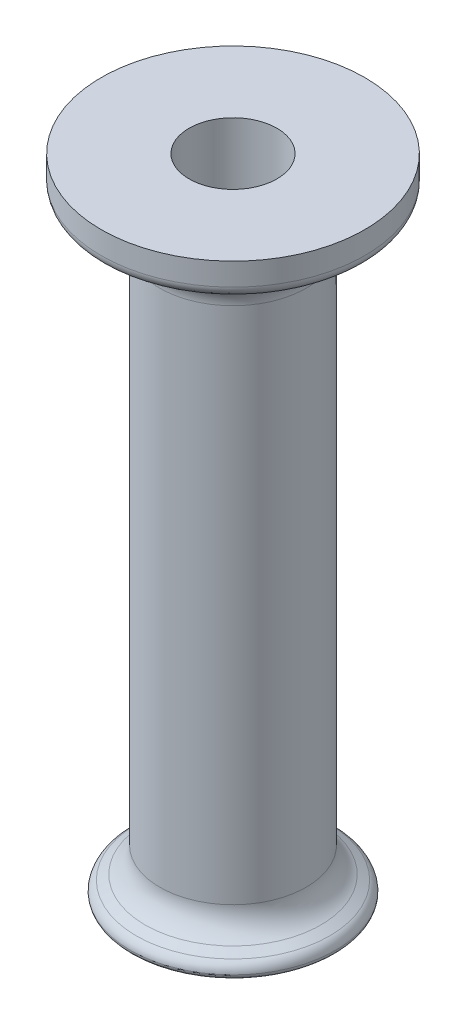
ISO-10303-21;
HEADER;
FILE_DESCRIPTION(('STEP AP214'),'2;1');
FILE_NAME('part.step','',(''),(''),'','','');
FILE_SCHEMA(('AUTOMOTIVE_DESIGN { 1 0 10303 214 1 1 1 1 }'));
ENDSEC;
DATA;
#1=APPLICATION_CONTEXT('core data for automotive mechanical design processes');
#2=APPLICATION_PROTOCOL_DEFINITION('international standard','automotive_design',2000,#1);
#3=PRODUCT_CONTEXT('',#1,'mechanical');
#4=PRODUCT('Part','Part','',(#3));
#5=PRODUCT_RELATED_PRODUCT_CATEGORY('part','',(#4));
#6=PRODUCT_DEFINITION_FORMATION('','',#4);
#7=PRODUCT_DEFINITION_CONTEXT('part definition',#1,'design');
#8=PRODUCT_DEFINITION('design','',#6,#7);
#9=PRODUCT_DEFINITION_SHAPE('','',#8);
#10=(LENGTH_UNIT() NAMED_UNIT(*) SI_UNIT(.MILLI.,.METRE.));
#11=(NAMED_UNIT(*) PLANE_ANGLE_UNIT() SI_UNIT($,.RADIAN.));
#12=(NAMED_UNIT(*) SI_UNIT($,.STERADIAN.) SOLID_ANGLE_UNIT());
#13=UNCERTAINTY_MEASURE_WITH_UNIT(LENGTH_MEASURE(1.E-05),#10,'distance_accuracy_value','');
#14=(GEOMETRIC_REPRESENTATION_CONTEXT(3) GLOBAL_UNCERTAINTY_ASSIGNED_CONTEXT((#13)) GLOBAL_UNIT_ASSIGNED_CONTEXT((#10,
#11,#12)) REPRESENTATION_CONTEXT('',''));
#15=CARTESIAN_POINT('',(0.,0.,0.));
#16=DIRECTION('',(0.,0.,1.));
#17=DIRECTION('',(1.,0.,0.));
#18=AXIS2_PLACEMENT_3D('',#15,#16,#17);
#19=CARTESIAN_POINT('',(0.,-51.5566243270259,0.));
#20=DIRECTION('',(0.,-1.,0.));
#21=DIRECTION('',(0.,0.,-1.));
#22=AXIS2_PLACEMENT_3D('',#19,#20,#21);
#23=CONICAL_SURFACE('',#22,15.,1.04719755119659);
#24=CARTESIAN_POINT('',(0.,-52.4226497308104,0.));
#25=DIRECTION('',(0.,-1.,0.));
#26=DIRECTION('',(0.,0.,-1.));
#27=AXIS2_PLACEMENT_3D('',#24,#25,#26);
#28=CIRCLE('',#27,16.5);
#29=CARTESIAN_POINT('',(0.,-52.4226497308104,-16.5));
#30=VERTEX_POINT('',#29);
#31=EDGE_CURVE('E55',#30,#30,#28,.T.);
#32=ORIENTED_EDGE('',*,*,#31,.F.);
#33=EDGE_LOOP('',(#32));
#34=FACE_BOUND('',#33,.T.);
#35=CARTESIAN_POINT('',(0.,-51.5566243270259,0.));
#36=DIRECTION('',(0.,-1.,0.));
#37=DIRECTION('',(0.,0.,-1.));
#38=AXIS2_PLACEMENT_3D('',#35,#36,#37);
#39=CIRCLE('',#38,15.);
#40=CARTESIAN_POINT('',(0.,-51.5566243270259,-15.));
#41=VERTEX_POINT('',#40);
#42=EDGE_CURVE('E85',#41,#41,#39,.T.);
#43=ORIENTED_EDGE('',*,*,#42,.T.);
#44=EDGE_LOOP('',(#43));
#45=FACE_BOUND('',#44,.T.);
#46=ADVANCED_FACE('F41',(#34,#45),#23,.T.);
#47=CARTESIAN_POINT('',(0.,-54.1547005383792,0.));
#48=DIRECTION('',(0.,-1.,0.));
#49=DIRECTION('',(0.,0.,-1.));
#50=AXIS2_PLACEMENT_3D('',#47,#48,#49);
#51=TOROIDAL_SURFACE('',#50,15.5,2.);
#52=CARTESIAN_POINT('',(0.,-54.0640694137426,0.));
#53=DIRECTION('',(0.,-1.,0.));
#54=DIRECTION('',(0.,0.,-1.));
#55=AXIS2_PLACEMENT_3D('',#52,#53,#54);
#56=CIRCLE('',#55,17.4979454445122);
#57=CARTESIAN_POINT('',(0.,-54.0640694137426,-17.4979454445122));
#58=VERTEX_POINT('',#57);
#59=EDGE_CURVE('E57',#58,#58,#56,.T.);
#60=ORIENTED_EDGE('',*,*,#59,.F.);
#61=EDGE_LOOP('',(#60));
#62=FACE_BOUND('',#61,.T.);
#63=ORIENTED_EDGE('',*,*,#31,.T.);
#64=EDGE_LOOP('',(#63));
#65=FACE_BOUND('',#64,.T.);
#66=ADVANCED_FACE('F104',(#62,#65),#51,.T.);
#67=CARTESIAN_POINT('',(0.,-54.,0.));
#68=DIRECTION('',(0.,-1.,0.));
#69=DIRECTION('',(0.,0.,-1.));
#70=AXIS2_PLACEMENT_3D('',#67,#68,#69);
#71=TOROIDAL_SURFACE('',#70,16.5,1.);
#72=CARTESIAN_POINT('',(0.,-55.,0.));
#73=DIRECTION('',(0.,-1.,0.));
#74=DIRECTION('',(0.,0.,-1.));
#75=AXIS2_PLACEMENT_3D('',#72,#73,#74);
#76=CIRCLE('',#75,16.5);
#77=CARTESIAN_POINT('',(0.,-55.,-16.5));
#78=VERTEX_POINT('',#77);
#79=EDGE_CURVE('E61',#78,#78,#76,.T.);
#80=ORIENTED_EDGE('',*,*,#79,.F.);
#81=EDGE_LOOP('',(#80));
#82=FACE_BOUND('',#81,.T.);
#83=ORIENTED_EDGE('',*,*,#59,.T.);
#84=EDGE_LOOP('',(#83));
#85=FACE_BOUND('',#84,.T.);
#86=ADVANCED_FACE('F109',(#82,#85),#71,.T.);
#87=CARTESIAN_POINT('',(0.,-55.,0.));
#88=DIRECTION('',(0.,-1.,0.));
#89=DIRECTION('',(0.,0.,-1.));
#90=AXIS2_PLACEMENT_3D('',#87,#88,#89);
#91=PLANE('',#90);
#92=ORIENTED_EDGE('',*,*,#79,.T.);
#93=EDGE_LOOP('',(#92));
#94=FACE_BOUND('',#93,.T.);
#95=CARTESIAN_POINT('',(0.,-55.,0.));
#96=DIRECTION('',(0.,-1.,0.));
#97=DIRECTION('',(0.,0.,-1.));
#98=AXIS2_PLACEMENT_3D('',#95,#96,#97);
#99=CIRCLE('',#98,7.5);
#100=CARTESIAN_POINT('',(0.,-55.,-7.5));
#101=VERTEX_POINT('',#100);
#102=EDGE_CURVE('E63',#101,#101,#99,.T.);
#103=ORIENTED_EDGE('',*,*,#102,.F.);
#104=EDGE_LOOP('',(#103));
#105=FACE_BOUND('',#104,.T.);
#106=ADVANCED_FACE('F117',(#94,#105),#91,.T.);
#107=CARTESIAN_POINT('',(0.,-16.1050714726648,0.));
#108=DIRECTION('',(0.,-1.,0.));
#109=DIRECTION('',(0.,0.,-1.));
#110=AXIS2_PLACEMENT_3D('',#107,#108,#109);
#111=CYLINDRICAL_SURFACE('',#110,7.5);
#112=CARTESIAN_POINT('',(0.,55.,0.));
#113=DIRECTION('',(0.,-1.,0.));
#114=DIRECTION('',(0.,0.,-1.));
#115=AXIS2_PLACEMENT_3D('',#112,#113,#114);
#116=CIRCLE('',#115,7.5);
#117=CARTESIAN_POINT('',(0.,55.,-7.5));
#118=VERTEX_POINT('',#117);
#119=EDGE_CURVE('E70',#118,#118,#116,.T.);
#120=ORIENTED_EDGE('',*,*,#119,.F.);
#121=EDGE_LOOP('',(#120));
#122=FACE_BOUND('',#121,.T.);
#123=ORIENTED_EDGE('',*,*,#102,.T.);
#124=EDGE_LOOP('',(#123));
#125=FACE_BOUND('',#124,.T.);
#126=ADVANCED_FACE('F122',(#122,#125),#111,.F.);
#127=CARTESIAN_POINT('',(0.,55.,0.));
#128=DIRECTION('',(0.,1.,0.));
#129=DIRECTION('',(0.,0.,1.));
#130=AXIS2_PLACEMENT_3D('',#127,#128,#129);
#131=PLANE('',#130);
#132=ORIENTED_EDGE('',*,*,#119,.T.);
#133=EDGE_LOOP('',(#132));
#134=FACE_BOUND('',#133,.T.);
#135=CARTESIAN_POINT('',(0.,55.,0.));
#136=DIRECTION('',(0.,-1.,0.));
#137=DIRECTION('',(0.,0.,-1.));
#138=AXIS2_PLACEMENT_3D('',#135,#136,#137);
#139=CIRCLE('',#138,22.5);
#140=CARTESIAN_POINT('',(0.,55.,-22.5));
#141=VERTEX_POINT('',#140);
#142=EDGE_CURVE('E66',#141,#141,#139,.T.);
#143=ORIENTED_EDGE('',*,*,#142,.F.);
#144=EDGE_LOOP('',(#143));
#145=FACE_BOUND('',#144,.T.);
#146=ADVANCED_FACE('F121',(#134,#145),#131,.T.);
#147=CARTESIAN_POINT('',(0.,-16.1050714726648,0.));
#148=DIRECTION('',(0.,-1.,0.));
#149=DIRECTION('',(0.,0.,-1.));
#150=AXIS2_PLACEMENT_3D('',#147,#148,#149);
#151=CYLINDRICAL_SURFACE('',#150,22.5);
#152=CARTESIAN_POINT('',(0.,51.1547005383793,0.));
#153=DIRECTION('',(0.,1.,0.));
#154=DIRECTION('',(0.,0.,1.));
#155=AXIS2_PLACEMENT_3D('',#152,#153,#154);
#156=CIRCLE('',#155,22.5);
#157=CARTESIAN_POINT('',(0.,51.1547005383793,22.5));
#158=VERTEX_POINT('',#157);
#159=EDGE_CURVE('E10',#158,#158,#156,.T.);
#160=ORIENTED_EDGE('',*,*,#159,.T.);
#161=EDGE_LOOP('',(#160));
#162=FACE_BOUND('',#161,.T.);
#163=ORIENTED_EDGE('',*,*,#142,.T.);
#164=EDGE_LOOP('',(#163));
#165=FACE_BOUND('',#164,.T.);
#166=ADVANCED_FACE('F129',(#162,#165),#151,.T.);
#167=CARTESIAN_POINT('',(0.,45.6698729810779,0.));
#168=DIRECTION('',(0.,1.,0.));
#169=DIRECTION('',(0.,0.,1.));
#170=AXIS2_PLACEMENT_3D('',#167,#168,#169);
#171=CONICAL_SURFACE('',#170,15.,1.0471975511966);
#172=CARTESIAN_POINT('',(0.,49.4226497308104,0.));
#173=DIRECTION('',(0.,-1.,0.));
#174=DIRECTION('',(0.,0.,-1.));
#175=AXIS2_PLACEMENT_3D('',#172,#173,#174);
#176=CIRCLE('',#175,21.5);
#177=CARTESIAN_POINT('',(0.,49.4226497308104,-21.5));
#178=VERTEX_POINT('',#177);
#179=EDGE_CURVE('E48',#178,#178,#176,.T.);
#180=ORIENTED_EDGE('',*,*,#179,.T.);
#181=EDGE_LOOP('',(#180));
#182=FACE_BOUND('',#181,.T.);
#183=CARTESIAN_POINT('',(0.,45.6698729810779,0.));
#184=DIRECTION('',(0.,-1.,0.));
#185=DIRECTION('',(0.,0.,-1.));
#186=AXIS2_PLACEMENT_3D('',#183,#184,#185);
#187=CIRCLE('',#186,15.);
#188=CARTESIAN_POINT('',(0.,45.6698729810779,-15.));
#189=VERTEX_POINT('',#188);
#190=EDGE_CURVE('E71',#189,#189,#187,.T.);
#191=ORIENTED_EDGE('',*,*,#190,.F.);
#192=EDGE_LOOP('',(#191));
#193=FACE_BOUND('',#192,.T.);
#194=ADVANCED_FACE('F101',(#182,#193),#171,.T.);
#195=CARTESIAN_POINT('',(0.,41.3397459621556,0.));
#196=DIRECTION('',(0.,-1.,0.));
#197=DIRECTION('',(0.,0.,-1.));
#198=AXIS2_PLACEMENT_3D('',#195,#196,#197);
#199=TOROIDAL_SURFACE('',#198,17.5,5.00000000000002);
#200=ORIENTED_EDGE('',*,*,#190,.T.);
#201=EDGE_LOOP('',(#200));
#202=FACE_BOUND('',#201,.T.);
#203=CARTESIAN_POINT('',(0.,41.3397459621557,0.));
#204=DIRECTION('',(0.,-1.,0.));
#205=DIRECTION('',(0.,0.,-1.));
#206=AXIS2_PLACEMENT_3D('',#203,#204,#205);
#207=CIRCLE('',#206,12.5);
#208=CARTESIAN_POINT('',(0.,41.3397459621557,-12.5));
#209=VERTEX_POINT('',#208);
#210=EDGE_CURVE('E76',#209,#209,#207,.T.);
#211=ORIENTED_EDGE('',*,*,#210,.F.);
#212=EDGE_LOOP('',(#211));
#213=FACE_BOUND('',#212,.T.);
#214=ADVANCED_FACE('F92',(#202,#213),#199,.F.);
#215=CARTESIAN_POINT('',(0.,-16.1050714726648,0.));
#216=DIRECTION('',(0.,-1.,0.));
#217=DIRECTION('',(0.,0.,-1.));
#218=AXIS2_PLACEMENT_3D('',#215,#216,#217);
#219=CYLINDRICAL_SURFACE('',#218,12.5);
#220=ORIENTED_EDGE('',*,*,#210,.T.);
#221=EDGE_LOOP('',(#220));
#222=FACE_BOUND('',#221,.T.);
#223=CARTESIAN_POINT('',(0.,-47.2264973081037,0.));
#224=DIRECTION('',(0.,-1.,0.));
#225=DIRECTION('',(0.,0.,-1.));
#226=AXIS2_PLACEMENT_3D('',#223,#224,#225);
#227=CIRCLE('',#226,12.5);
#228=CARTESIAN_POINT('',(0.,-47.2264973081037,-12.5));
#229=VERTEX_POINT('',#228);
#230=EDGE_CURVE('E78',#229,#229,#227,.T.);
#231=ORIENTED_EDGE('',*,*,#230,.F.);
#232=EDGE_LOOP('',(#231));
#233=FACE_BOUND('',#232,.T.);
#234=ADVANCED_FACE('F89',(#222,#233),#219,.T.);
#235=CARTESIAN_POINT('',(0.,-47.2264973081037,0.));
#236=DIRECTION('',(0.,-1.,0.));
#237=DIRECTION('',(0.,0.,-1.));
#238=AXIS2_PLACEMENT_3D('',#235,#236,#237);
#239=TOROIDAL_SURFACE('',#238,17.5,5.);
#240=ORIENTED_EDGE('',*,*,#42,.F.);
#241=EDGE_LOOP('',(#240));
#242=FACE_BOUND('',#241,.T.);
#243=ORIENTED_EDGE('',*,*,#230,.T.);
#244=EDGE_LOOP('',(#243));
#245=FACE_BOUND('',#244,.T.);
#246=ADVANCED_FACE('F87',(#242,#245),#239,.F.);
#247=CARTESIAN_POINT('',(0.,51.1547005383793,0.));
#248=DIRECTION('',(0.,1.,0.));
#249=DIRECTION('',(0.,0.,1.));
#250=AXIS2_PLACEMENT_3D('',#247,#248,#249);
#251=TOROIDAL_SURFACE('',#250,20.5,2.);
#252=ORIENTED_EDGE('',*,*,#159,.F.);
#253=EDGE_LOOP('',(#252));
#254=FACE_BOUND('',#253,.T.);
#255=ORIENTED_EDGE('',*,*,#179,.F.);
#256=EDGE_LOOP('',(#255));
#257=FACE_BOUND('',#256,.T.);
#258=ADVANCED_FACE('F43',(#254,#257),#251,.T.);
#259=CLOSED_SHELL('',(#46,#66,#86,#106,#126,#146,#166,#194,#214,#234,#246,#258));
#260=MANIFOLD_SOLID_BREP('B2',#259);
#261=ADVANCED_BREP_SHAPE_REPRESENTATION('',(#18,#260),#14);
#262=SHAPE_DEFINITION_REPRESENTATION(#9,#261);
ENDSEC;
END-ISO-10303-21;
